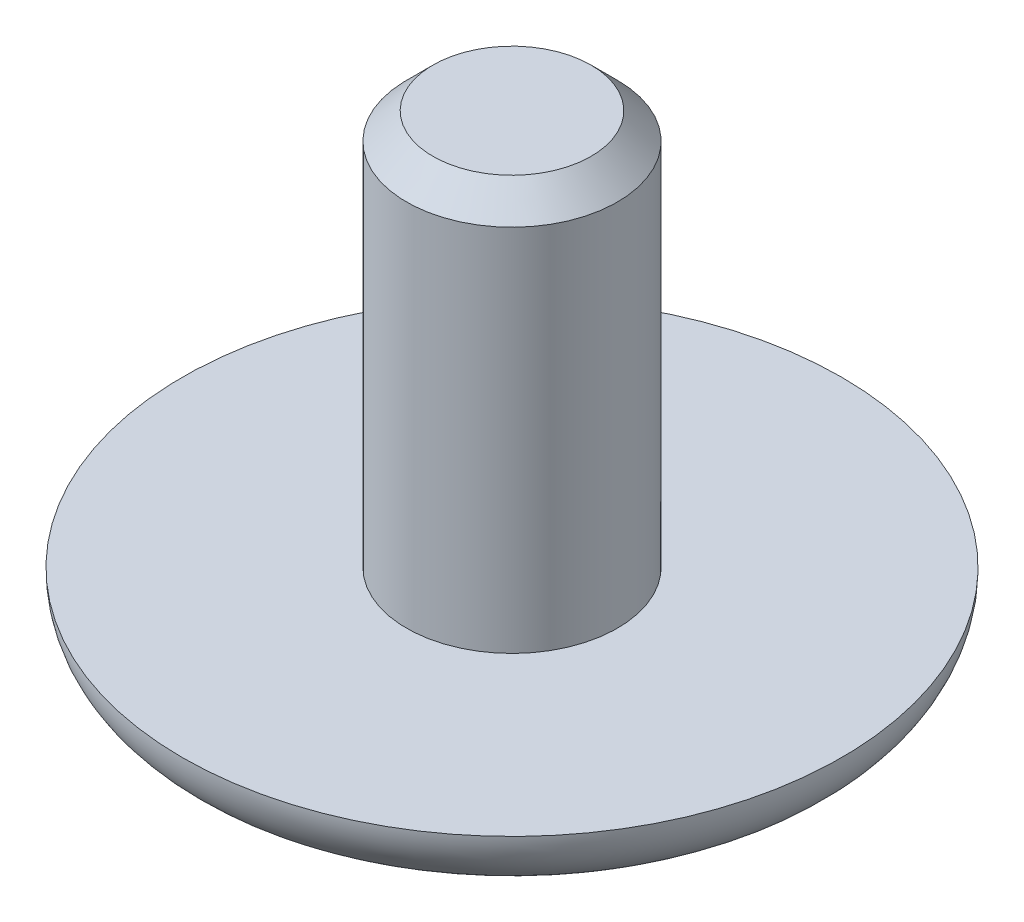
ISO-10303-21;
HEADER;
FILE_DESCRIPTION(('STEP AP214'),'2;1');
FILE_NAME('part.step','',(''),(''),'','','');
FILE_SCHEMA(('AUTOMOTIVE_DESIGN { 1 0 10303 214 1 1 1 1 }'));
ENDSEC;
DATA;
#1=APPLICATION_CONTEXT('core data for automotive mechanical design processes');
#2=APPLICATION_PROTOCOL_DEFINITION('international standard','automotive_design',2000,#1);
#3=PRODUCT_CONTEXT('',#1,'mechanical');
#4=PRODUCT('Part','Part','',(#3));
#5=PRODUCT_RELATED_PRODUCT_CATEGORY('part','',(#4));
#6=PRODUCT_DEFINITION_FORMATION('','',#4);
#7=PRODUCT_DEFINITION_CONTEXT('part definition',#1,'design');
#8=PRODUCT_DEFINITION('design','',#6,#7);
#9=PRODUCT_DEFINITION_SHAPE('','',#8);
#10=(LENGTH_UNIT() NAMED_UNIT(*) SI_UNIT(.MILLI.,.METRE.));
#11=(NAMED_UNIT(*) PLANE_ANGLE_UNIT() SI_UNIT($,.RADIAN.));
#12=(NAMED_UNIT(*) SI_UNIT($,.STERADIAN.) SOLID_ANGLE_UNIT());
#13=UNCERTAINTY_MEASURE_WITH_UNIT(LENGTH_MEASURE(1.E-05),#10,'distance_accuracy_value','');
#14=(GEOMETRIC_REPRESENTATION_CONTEXT(3) GLOBAL_UNCERTAINTY_ASSIGNED_CONTEXT((#13)) GLOBAL_UNIT_ASSIGNED_CONTEXT((#10,
#11,#12)) REPRESENTATION_CONTEXT('',''));
#15=CARTESIAN_POINT('',(0.,0.,0.));
#16=DIRECTION('',(0.,0.,1.));
#17=DIRECTION('',(1.,0.,0.));
#18=AXIS2_PLACEMENT_3D('',#15,#16,#17);
#19=CARTESIAN_POINT('',(0.,0.,0.));
#20=DIRECTION('',(0.,1.,0.));
#21=DIRECTION('',(0.,0.,1.));
#22=AXIS2_PLACEMENT_3D('',#19,#20,#21);
#23=PLANE('',#22);
#24=CARTESIAN_POINT('',(0.,0.,0.));
#25=DIRECTION('',(0.,1.,0.));
#26=DIRECTION('',(0.,0.,1.));
#27=AXIS2_PLACEMENT_3D('',#24,#25,#26);
#28=CIRCLE('',#27,2.);
#29=CARTESIAN_POINT('',(0.,0.,2.));
#30=VERTEX_POINT('',#29);
#31=EDGE_CURVE('E11',#30,#30,#28,.F.);
#32=ORIENTED_EDGE('',*,*,#31,.T.);
#33=EDGE_LOOP('',(#32));
#34=FACE_BOUND('',#33,.T.);
#35=DIRECTION('',(0.,0.,-1.));
#36=VECTOR('',#35,1.);
#37=CARTESIAN_POINT('',(1.75,0.,0.));
#38=LINE('',#37,#36);
#39=CARTESIAN_POINT('',(1.75,0.,0.4));
#40=VERTEX_POINT('',#39);
#41=CARTESIAN_POINT('',(1.75,0.,-0.4));
#42=VERTEX_POINT('',#41);
#43=EDGE_CURVE('E64',#40,#42,#38,.T.);
#44=ORIENTED_EDGE('',*,*,#43,.T.);
#45=DIRECTION('',(1.,0.,0.));
#46=VECTOR('',#45,1.);
#47=CARTESIAN_POINT('',(0.,0.,-0.4));
#48=LINE('',#47,#46);
#49=CARTESIAN_POINT('',(0.4,0.,-0.4));
#50=VERTEX_POINT('',#49);
#51=EDGE_CURVE('E192',#50,#42,#48,.T.);
#52=ORIENTED_EDGE('',*,*,#51,.F.);
#53=DIRECTION('',(0.,0.,-1.));
#54=VECTOR('',#53,1.);
#55=CARTESIAN_POINT('',(0.4,0.,0.));
#56=LINE('',#55,#54);
#57=CARTESIAN_POINT('',(0.4,0.,-1.75));
#58=VERTEX_POINT('',#57);
#59=EDGE_CURVE('E189',#50,#58,#56,.T.);
#60=ORIENTED_EDGE('',*,*,#59,.T.);
#61=DIRECTION('',(1.,0.,0.));
#62=VECTOR('',#61,1.);
#63=CARTESIAN_POINT('',(0.,0.,-1.75));
#64=LINE('',#63,#62);
#65=CARTESIAN_POINT('',(-0.4,0.,-1.75));
#66=VERTEX_POINT('',#65);
#67=EDGE_CURVE('E186',#66,#58,#64,.T.);
#68=ORIENTED_EDGE('',*,*,#67,.F.);
#69=DIRECTION('',(0.,0.,-1.));
#70=VECTOR('',#69,1.);
#71=CARTESIAN_POINT('',(-0.4,0.,0.));
#72=LINE('',#71,#70);
#73=CARTESIAN_POINT('',(-0.4,0.,-0.4));
#74=VERTEX_POINT('',#73);
#75=EDGE_CURVE('E183',#74,#66,#72,.T.);
#76=ORIENTED_EDGE('',*,*,#75,.F.);
#77=DIRECTION('',(1.,0.,0.));
#78=VECTOR('',#77,1.);
#79=CARTESIAN_POINT('',(0.,0.,-0.4));
#80=LINE('',#79,#78);
#81=CARTESIAN_POINT('',(-1.75,0.,-0.4));
#82=VERTEX_POINT('',#81);
#83=EDGE_CURVE('E180',#82,#74,#80,.T.);
#84=ORIENTED_EDGE('',*,*,#83,.F.);
#85=DIRECTION('',(0.,0.,-1.));
#86=VECTOR('',#85,1.);
#87=CARTESIAN_POINT('',(-1.75,0.,0.));
#88=LINE('',#87,#86);
#89=CARTESIAN_POINT('',(-1.75,0.,0.4));
#90=VERTEX_POINT('',#89);
#91=EDGE_CURVE('E177',#90,#82,#88,.T.);
#92=ORIENTED_EDGE('',*,*,#91,.F.);
#93=DIRECTION('',(1.,0.,0.));
#94=VECTOR('',#93,1.);
#95=CARTESIAN_POINT('',(0.,0.,0.4));
#96=LINE('',#95,#94);
#97=CARTESIAN_POINT('',(-0.4,0.,0.4));
#98=VERTEX_POINT('',#97);
#99=EDGE_CURVE('E174',#90,#98,#96,.T.);
#100=ORIENTED_EDGE('',*,*,#99,.T.);
#101=DIRECTION('',(0.,0.,-1.));
#102=VECTOR('',#101,1.);
#103=CARTESIAN_POINT('',(-0.4,0.,0.));
#104=LINE('',#103,#102);
#105=CARTESIAN_POINT('',(-0.4,0.,1.75));
#106=VERTEX_POINT('',#105);
#107=EDGE_CURVE('E168',#106,#98,#104,.T.);
#108=ORIENTED_EDGE('',*,*,#107,.F.);
#109=DIRECTION('',(1.,0.,0.));
#110=VECTOR('',#109,1.);
#111=CARTESIAN_POINT('',(0.,0.,1.75));
#112=LINE('',#111,#110);
#113=CARTESIAN_POINT('',(0.4,0.,1.75));
#114=VERTEX_POINT('',#113);
#115=EDGE_CURVE('E166',#106,#114,#112,.T.);
#116=ORIENTED_EDGE('',*,*,#115,.T.);
#117=DIRECTION('',(0.,0.,-1.));
#118=VECTOR('',#117,1.);
#119=CARTESIAN_POINT('',(0.4,0.,0.));
#120=LINE('',#119,#118);
#121=CARTESIAN_POINT('',(0.4,0.,0.4));
#122=VERTEX_POINT('',#121);
#123=EDGE_CURVE('E152',#114,#122,#120,.T.);
#124=ORIENTED_EDGE('',*,*,#123,.T.);
#125=DIRECTION('',(1.,0.,0.));
#126=VECTOR('',#125,1.);
#127=CARTESIAN_POINT('',(0.,0.,0.4));
#128=LINE('',#127,#126);
#129=EDGE_CURVE('E160',#122,#40,#128,.T.);
#130=ORIENTED_EDGE('',*,*,#129,.T.);
#131=EDGE_LOOP('',(#44,#52,#60,#68,#76,#84,#92,#100,#108,#116,#124,#130));
#132=FACE_BOUND('',#131,.T.);
#133=ADVANCED_FACE('F49',(#34,#132),#23,.F.);
#134=CARTESIAN_POINT('',(-2.5,0.5,0.));
#135=DIRECTION('',(0.,-1.,0.));
#136=DIRECTION('',(0.,0.,-1.));
#137=AXIS2_PLACEMENT_3D('',#134,#135,#136);
#138=PLANE('',#137);
#139=CARTESIAN_POINT('',(0.,0.5,0.));
#140=DIRECTION('',(0.,-1.,0.));
#141=DIRECTION('',(0.,0.,-1.));
#142=AXIS2_PLACEMENT_3D('',#139,#140,#141);
#143=CIRCLE('',#142,2.5);
#144=CARTESIAN_POINT('',(0.,0.5,-2.5));
#145=VERTEX_POINT('',#144);
#146=EDGE_CURVE('E242',#145,#145,#143,.T.);
#147=ORIENTED_EDGE('',*,*,#146,.F.);
#148=EDGE_LOOP('',(#147));
#149=FACE_BOUND('',#148,.T.);
#150=CARTESIAN_POINT('',(0.,0.5,0.));
#151=DIRECTION('',(0.,-1.,0.));
#152=DIRECTION('',(0.,0.,-1.));
#153=AXIS2_PLACEMENT_3D('',#150,#151,#152);
#154=CIRCLE('',#153,0.8);
#155=CARTESIAN_POINT('',(0.,0.5,-0.8));
#156=VERTEX_POINT('',#155);
#157=EDGE_CURVE('E195',#156,#156,#154,.T.);
#158=ORIENTED_EDGE('',*,*,#157,.T.);
#159=EDGE_LOOP('',(#158));
#160=FACE_BOUND('',#159,.T.);
#161=ADVANCED_FACE('F260',(#149,#160),#138,.F.);
#162=CARTESIAN_POINT('',(0.,0.,0.));
#163=DIRECTION('',(0.,-1.,0.));
#164=DIRECTION('',(0.,0.,-1.));
#165=AXIS2_PLACEMENT_3D('',#162,#163,#164);
#166=CYLINDRICAL_SURFACE('',#165,0.8);
#167=CARTESIAN_POINT('',(0.,3.3,0.));
#168=DIRECTION('',(0.,-1.,0.));
#169=DIRECTION('',(0.,0.,-1.));
#170=AXIS2_PLACEMENT_3D('',#167,#168,#169);
#171=CIRCLE('',#170,0.8);
#172=CARTESIAN_POINT('',(0.,3.3,-0.8));
#173=VERTEX_POINT('',#172);
#174=EDGE_CURVE('E245',#173,#173,#171,.T.);
#175=ORIENTED_EDGE('',*,*,#174,.T.);
#176=EDGE_LOOP('',(#175));
#177=FACE_BOUND('',#176,.T.);
#178=ORIENTED_EDGE('',*,*,#157,.F.);
#179=EDGE_LOOP('',(#178));
#180=FACE_BOUND('',#179,.T.);
#181=ADVANCED_FACE('F257',(#177,#180),#166,.T.);
#182=CARTESIAN_POINT('',(-0.8,3.5,0.));
#183=DIRECTION('',(0.,-1.,0.));
#184=DIRECTION('',(0.,0.,-1.));
#185=AXIS2_PLACEMENT_3D('',#182,#183,#184);
#186=PLANE('',#185);
#187=CARTESIAN_POINT('',(0.,3.5,0.));
#188=DIRECTION('',(0.,-1.,0.));
#189=DIRECTION('',(0.,0.,-1.));
#190=AXIS2_PLACEMENT_3D('',#187,#188,#189);
#191=CIRCLE('',#190,0.599999999999999);
#192=CARTESIAN_POINT('',(0.,3.5,-0.599999999999999));
#193=VERTEX_POINT('',#192);
#194=EDGE_CURVE('E57',#193,#193,#191,.F.);
#195=ORIENTED_EDGE('',*,*,#194,.T.);
#196=EDGE_LOOP('',(#195));
#197=FACE_BOUND('',#196,.T.);
#198=ADVANCED_FACE('F250',(#197),#186,.F.);
#199=CARTESIAN_POINT('',(0.,3.3,0.));
#200=DIRECTION('',(0.,-1.,0.));
#201=DIRECTION('',(0.,0.,-1.));
#202=AXIS2_PLACEMENT_3D('',#199,#200,#201);
#203=CONICAL_SURFACE('',#202,0.8,0.785398163397453);
#204=ORIENTED_EDGE('',*,*,#194,.F.);
#205=EDGE_LOOP('',(#204));
#206=FACE_BOUND('',#205,.T.);
#207=ORIENTED_EDGE('',*,*,#174,.F.);
#208=EDGE_LOOP('',(#207));
#209=FACE_BOUND('',#208,.T.);
#210=ADVANCED_FACE('F252',(#206,#209),#203,.T.);
#211=CARTESIAN_POINT('',(0.,0.5,0.));
#212=DIRECTION('',(0.,1.,0.));
#213=DIRECTION('',(0.,0.,1.));
#214=AXIS2_PLACEMENT_3D('',#211,#212,#213);
#215=TOROIDAL_SURFACE('',#214,2.,0.5);
#216=ORIENTED_EDGE('',*,*,#146,.T.);
#217=EDGE_LOOP('',(#216));
#218=FACE_BOUND('',#217,.T.);
#219=ORIENTED_EDGE('',*,*,#31,.F.);
#220=EDGE_LOOP('',(#219));
#221=FACE_BOUND('',#220,.T.);
#222=ADVANCED_FACE('F51',(#218,#221),#215,.T.);
#223=CARTESIAN_POINT('',(1.75,0.,0.));
#224=DIRECTION('',(0.90630778703665,0.4226182617407,0.));
#225=DIRECTION('',(-0.4226182617407,0.90630778703665,0.));
#226=AXIS2_PLACEMENT_3D('',#223,#224,#225);
#227=PLANE('',#226);
#228=ORIENTED_EDGE('',*,*,#43,.F.);
#229=DIRECTION('',(0.389281620635025,-0.834817129478988,0.389281620635025));
#230=VECTOR('',#229,1.);
#231=CARTESIAN_POINT('',(1.68938392793431,0.129991586038984,0.339383927934307));
#232=LINE('',#231,#230);
#233=CARTESIAN_POINT('',(1.6101077025535,0.3,0.2601077025535));
#234=VERTEX_POINT('',#233);
#235=EDGE_CURVE('E157',#234,#40,#232,.T.);
#236=ORIENTED_EDGE('',*,*,#235,.F.);
#237=DIRECTION('',(0.,0.,1.));
#238=VECTOR('',#237,1.);
#239=CARTESIAN_POINT('',(1.6101077025535,0.3,0.));
#240=LINE('',#239,#238);
#241=CARTESIAN_POINT('',(1.6101077025535,0.3,-0.2601077025535));
#242=VERTEX_POINT('',#241);
#243=EDGE_CURVE('E70',#234,#242,#240,.F.);
#244=ORIENTED_EDGE('',*,*,#243,.T.);
#245=DIRECTION('',(-0.389281620635025,0.834817129478988,0.389281620635025));
#246=VECTOR('',#245,1.);
#247=CARTESIAN_POINT('',(1.68938392793431,0.129991586038984,-0.339383927934307));
#248=LINE('',#247,#246);
#249=EDGE_CURVE('E111',#242,#42,#248,.F.);
#250=ORIENTED_EDGE('',*,*,#249,.T.);
#251=EDGE_LOOP('',(#228,#236,#244,#250));
#252=FACE_BOUND('',#251,.T.);
#253=ADVANCED_FACE('F283',(#252),#227,.F.);
#254=CARTESIAN_POINT('',(0.,0.,-0.4));
#255=DIRECTION('',(0.,0.4226182617407,-0.90630778703665));
#256=DIRECTION('',(0.,0.90630778703665,0.4226182617407));
#257=AXIS2_PLACEMENT_3D('',#254,#255,#256);
#258=PLANE('',#257);
#259=ORIENTED_EDGE('',*,*,#51,.T.);
#260=ORIENTED_EDGE('',*,*,#249,.F.);
#261=DIRECTION('',(1.,0.,0.));
#262=VECTOR('',#261,1.);
#263=CARTESIAN_POINT('',(0.,0.3,-0.2601077025535));
#264=LINE('',#263,#262);
#265=CARTESIAN_POINT('',(0.2601077025535,0.3,-0.2601077025535));
#266=VERTEX_POINT('',#265);
#267=EDGE_CURVE('E196',#266,#242,#264,.T.);
#268=ORIENTED_EDGE('',*,*,#267,.F.);
#269=DIRECTION('',(-0.389281620635025,0.834817129478988,0.389281620635025));
#270=VECTOR('',#269,1.);
#271=CARTESIAN_POINT('',(0.339383927934307,0.129991586038984,-0.339383927934307));
#272=LINE('',#271,#270);
#273=EDGE_CURVE('E117',#266,#50,#272,.F.);
#274=ORIENTED_EDGE('',*,*,#273,.T.);
#275=EDGE_LOOP('',(#259,#260,#268,#274));
#276=FACE_BOUND('',#275,.T.);
#277=ADVANCED_FACE('F279',(#276),#258,.F.);
#278=CARTESIAN_POINT('',(0.4,0.,0.));
#279=DIRECTION('',(0.90630778703665,0.4226182617407,0.));
#280=DIRECTION('',(-0.4226182617407,0.90630778703665,0.));
#281=AXIS2_PLACEMENT_3D('',#278,#279,#280);
#282=PLANE('',#281);
#283=ORIENTED_EDGE('',*,*,#59,.F.);
#284=ORIENTED_EDGE('',*,*,#273,.F.);
#285=DIRECTION('',(0.,0.,1.));
#286=VECTOR('',#285,1.);
#287=CARTESIAN_POINT('',(0.2601077025535,0.3,0.));
#288=LINE('',#287,#286);
#289=CARTESIAN_POINT('',(0.2601077025535,0.3,-1.6101077025535));
#290=VERTEX_POINT('',#289);
#291=EDGE_CURVE('E217',#266,#290,#288,.F.);
#292=ORIENTED_EDGE('',*,*,#291,.T.);
#293=DIRECTION('',(-0.389281620635025,0.834817129478988,0.389281620635025));
#294=VECTOR('',#293,1.);
#295=CARTESIAN_POINT('',(0.134804684712595,0.568713188920555,-1.48480468471259));
#296=LINE('',#295,#294);
#297=EDGE_CURVE('E211',#290,#58,#296,.F.);
#298=ORIENTED_EDGE('',*,*,#297,.T.);
#299=EDGE_LOOP('',(#283,#284,#292,#298));
#300=FACE_BOUND('',#299,.T.);
#301=ADVANCED_FACE('F282',(#300),#282,.F.);
#302=CARTESIAN_POINT('',(0.,0.,-1.75));
#303=DIRECTION('',(0.,0.4226182617407,-0.90630778703665));
#304=DIRECTION('',(0.,0.90630778703665,0.4226182617407));
#305=AXIS2_PLACEMENT_3D('',#302,#303,#304);
#306=PLANE('',#305);
#307=ORIENTED_EDGE('',*,*,#67,.T.);
#308=ORIENTED_EDGE('',*,*,#297,.F.);
#309=DIRECTION('',(1.,0.,0.));
#310=VECTOR('',#309,1.);
#311=CARTESIAN_POINT('',(0.,0.3,-1.6101077025535));
#312=LINE('',#311,#310);
#313=CARTESIAN_POINT('',(-0.2601077025535,0.3,-1.6101077025535));
#314=VERTEX_POINT('',#313);
#315=EDGE_CURVE('E219',#314,#290,#312,.T.);
#316=ORIENTED_EDGE('',*,*,#315,.F.);
#317=DIRECTION('',(-0.389281620635025,-0.834817129478988,-0.389281620635025));
#318=VECTOR('',#317,1.);
#319=CARTESIAN_POINT('',(-0.134804684712595,0.568713188920555,-1.48480468471259));
#320=LINE('',#319,#318);
#321=EDGE_CURVE('E209',#314,#66,#320,.T.);
#322=ORIENTED_EDGE('',*,*,#321,.T.);
#323=EDGE_LOOP('',(#307,#308,#316,#322));
#324=FACE_BOUND('',#323,.T.);
#325=ADVANCED_FACE('F286',(#324),#306,.F.);
#326=CARTESIAN_POINT('',(-0.4,0.,0.));
#327=DIRECTION('',(-0.90630778703665,0.4226182617407,0.));
#328=DIRECTION('',(-0.4226182617407,-0.90630778703665,0.));
#329=AXIS2_PLACEMENT_3D('',#326,#327,#328);
#330=PLANE('',#329);
#331=ORIENTED_EDGE('',*,*,#75,.T.);
#332=ORIENTED_EDGE('',*,*,#321,.F.);
#333=DIRECTION('',(0.,0.,-1.));
#334=VECTOR('',#333,1.);
#335=CARTESIAN_POINT('',(-0.2601077025535,0.3,0.));
#336=LINE('',#335,#334);
#337=CARTESIAN_POINT('',(-0.2601077025535,0.3,-0.2601077025535));
#338=VERTEX_POINT('',#337);
#339=EDGE_CURVE('E222',#338,#314,#336,.T.);
#340=ORIENTED_EDGE('',*,*,#339,.F.);
#341=DIRECTION('',(-0.389281620635025,-0.834817129478988,-0.389281620635025));
#342=VECTOR('',#341,1.);
#343=CARTESIAN_POINT('',(-0.339383927934307,0.129991586038984,-0.339383927934307));
#344=LINE('',#343,#342);
#345=EDGE_CURVE('E207',#338,#74,#344,.T.);
#346=ORIENTED_EDGE('',*,*,#345,.T.);
#347=EDGE_LOOP('',(#331,#332,#340,#346));
#348=FACE_BOUND('',#347,.T.);
#349=ADVANCED_FACE('F290',(#348),#330,.F.);
#350=CARTESIAN_POINT('',(0.,0.,-0.4));
#351=DIRECTION('',(0.,0.4226182617407,-0.90630778703665));
#352=DIRECTION('',(0.,0.90630778703665,0.4226182617407));
#353=AXIS2_PLACEMENT_3D('',#350,#351,#352);
#354=PLANE('',#353);
#355=ORIENTED_EDGE('',*,*,#83,.T.);
#356=ORIENTED_EDGE('',*,*,#345,.F.);
#357=DIRECTION('',(1.,0.,0.));
#358=VECTOR('',#357,1.);
#359=CARTESIAN_POINT('',(0.,0.3,-0.2601077025535));
#360=LINE('',#359,#358);
#361=CARTESIAN_POINT('',(-1.6101077025535,0.3,-0.2601077025535));
#362=VERTEX_POINT('',#361);
#363=EDGE_CURVE('E225',#362,#338,#360,.T.);
#364=ORIENTED_EDGE('',*,*,#363,.F.);
#365=DIRECTION('',(-0.389281620635025,-0.834817129478988,-0.389281620635025));
#366=VECTOR('',#365,1.);
#367=CARTESIAN_POINT('',(-1.68938392793431,0.129991586038984,-0.339383927934307));
#368=LINE('',#367,#366);
#369=EDGE_CURVE('E205',#362,#82,#368,.T.);
#370=ORIENTED_EDGE('',*,*,#369,.T.);
#371=EDGE_LOOP('',(#355,#356,#364,#370));
#372=FACE_BOUND('',#371,.T.);
#373=ADVANCED_FACE('F294',(#372),#354,.F.);
#374=CARTESIAN_POINT('',(-1.75,0.,0.));
#375=DIRECTION('',(-0.90630778703665,0.4226182617407,0.));
#376=DIRECTION('',(-0.4226182617407,-0.90630778703665,0.));
#377=AXIS2_PLACEMENT_3D('',#374,#375,#376);
#378=PLANE('',#377);
#379=ORIENTED_EDGE('',*,*,#91,.T.);
#380=ORIENTED_EDGE('',*,*,#369,.F.);
#381=DIRECTION('',(0.,0.,-1.));
#382=VECTOR('',#381,1.);
#383=CARTESIAN_POINT('',(-1.6101077025535,0.3,0.));
#384=LINE('',#383,#382);
#385=CARTESIAN_POINT('',(-1.6101077025535,0.3,0.2601077025535));
#386=VERTEX_POINT('',#385);
#387=EDGE_CURVE('E228',#386,#362,#384,.T.);
#388=ORIENTED_EDGE('',*,*,#387,.F.);
#389=DIRECTION('',(0.389281620635025,0.834817129478988,-0.389281620635025));
#390=VECTOR('',#389,1.);
#391=CARTESIAN_POINT('',(-1.68938392793431,0.129991586038984,0.339383927934307));
#392=LINE('',#391,#390);
#393=EDGE_CURVE('E203',#386,#90,#392,.F.);
#394=ORIENTED_EDGE('',*,*,#393,.T.);
#395=EDGE_LOOP('',(#379,#380,#388,#394));
#396=FACE_BOUND('',#395,.T.);
#397=ADVANCED_FACE('F298',(#396),#378,.F.);
#398=CARTESIAN_POINT('',(0.,0.,0.4));
#399=DIRECTION('',(0.,0.4226182617407,0.90630778703665));
#400=DIRECTION('',(0.,-0.90630778703665,0.4226182617407));
#401=AXIS2_PLACEMENT_3D('',#398,#399,#400);
#402=PLANE('',#401);
#403=ORIENTED_EDGE('',*,*,#99,.F.);
#404=ORIENTED_EDGE('',*,*,#393,.F.);
#405=DIRECTION('',(-1.,0.,0.));
#406=VECTOR('',#405,1.);
#407=CARTESIAN_POINT('',(0.,0.3,0.2601077025535));
#408=LINE('',#407,#406);
#409=CARTESIAN_POINT('',(-0.2601077025535,0.3,0.2601077025535));
#410=VERTEX_POINT('',#409);
#411=EDGE_CURVE('E231',#386,#410,#408,.F.);
#412=ORIENTED_EDGE('',*,*,#411,.T.);
#413=DIRECTION('',(0.389281620635025,0.834817129478988,-0.389281620635025));
#414=VECTOR('',#413,1.);
#415=CARTESIAN_POINT('',(-0.339383927934307,0.129991586038984,0.339383927934307));
#416=LINE('',#415,#414);
#417=EDGE_CURVE('E201',#410,#98,#416,.F.);
#418=ORIENTED_EDGE('',*,*,#417,.T.);
#419=EDGE_LOOP('',(#403,#404,#412,#418));
#420=FACE_BOUND('',#419,.T.);
#421=ADVANCED_FACE('F302',(#420),#402,.F.);
#422=CARTESIAN_POINT('',(-0.4,0.,0.));
#423=DIRECTION('',(-0.90630778703665,0.4226182617407,0.));
#424=DIRECTION('',(-0.4226182617407,-0.90630778703665,0.));
#425=AXIS2_PLACEMENT_3D('',#422,#423,#424);
#426=PLANE('',#425);
#427=ORIENTED_EDGE('',*,*,#107,.T.);
#428=ORIENTED_EDGE('',*,*,#417,.F.);
#429=DIRECTION('',(0.,0.,-1.));
#430=VECTOR('',#429,1.);
#431=CARTESIAN_POINT('',(-0.2601077025535,0.3,0.));
#432=LINE('',#431,#430);
#433=CARTESIAN_POINT('',(-0.260107702553501,0.3,1.6101077025535));
#434=VERTEX_POINT('',#433);
#435=EDGE_CURVE('E233',#434,#410,#432,.T.);
#436=ORIENTED_EDGE('',*,*,#435,.F.);
#437=DIRECTION('',(0.389281620635025,0.834817129478988,-0.389281620635025));
#438=VECTOR('',#437,1.);
#439=CARTESIAN_POINT('',(-0.134804684712595,0.568713188920555,1.48480468471259));
#440=LINE('',#439,#438);
#441=EDGE_CURVE('E199',#434,#106,#440,.F.);
#442=ORIENTED_EDGE('',*,*,#441,.T.);
#443=EDGE_LOOP('',(#427,#428,#436,#442));
#444=FACE_BOUND('',#443,.T.);
#445=ADVANCED_FACE('F306',(#444),#426,.F.);
#446=CARTESIAN_POINT('',(0.,0.,1.75));
#447=DIRECTION('',(0.,0.4226182617407,0.90630778703665));
#448=DIRECTION('',(0.,-0.90630778703665,0.4226182617407));
#449=AXIS2_PLACEMENT_3D('',#446,#447,#448);
#450=PLANE('',#449);
#451=ORIENTED_EDGE('',*,*,#115,.F.);
#452=ORIENTED_EDGE('',*,*,#441,.F.);
#453=DIRECTION('',(-1.,0.,0.));
#454=VECTOR('',#453,1.);
#455=CARTESIAN_POINT('',(0.,0.3,1.6101077025535));
#456=LINE('',#455,#454);
#457=CARTESIAN_POINT('',(0.2601077025535,0.3,1.6101077025535));
#458=VERTEX_POINT('',#457);
#459=EDGE_CURVE('E236',#434,#458,#456,.F.);
#460=ORIENTED_EDGE('',*,*,#459,.T.);
#461=DIRECTION('',(0.389281620635025,-0.834817129478988,0.389281620635025));
#462=VECTOR('',#461,1.);
#463=CARTESIAN_POINT('',(0.134804684712594,0.568713188920555,1.48480468471259));
#464=LINE('',#463,#462);
#465=EDGE_CURVE('E156',#458,#114,#464,.T.);
#466=ORIENTED_EDGE('',*,*,#465,.T.);
#467=EDGE_LOOP('',(#451,#452,#460,#466));
#468=FACE_BOUND('',#467,.T.);
#469=ADVANCED_FACE('F310',(#468),#450,.F.);
#470=CARTESIAN_POINT('',(0.4,0.,0.));
#471=DIRECTION('',(0.90630778703665,0.4226182617407,0.));
#472=DIRECTION('',(-0.4226182617407,0.90630778703665,0.));
#473=AXIS2_PLACEMENT_3D('',#470,#471,#472);
#474=PLANE('',#473);
#475=ORIENTED_EDGE('',*,*,#123,.F.);
#476=ORIENTED_EDGE('',*,*,#465,.F.);
#477=DIRECTION('',(0.,0.,1.));
#478=VECTOR('',#477,1.);
#479=CARTESIAN_POINT('',(0.2601077025535,0.3,0.));
#480=LINE('',#479,#478);
#481=CARTESIAN_POINT('',(0.2601077025535,0.3,0.2601077025535));
#482=VERTEX_POINT('',#481);
#483=EDGE_CURVE('E155',#458,#482,#480,.F.);
#484=ORIENTED_EDGE('',*,*,#483,.T.);
#485=DIRECTION('',(0.389281620635025,-0.834817129478988,0.389281620635025));
#486=VECTOR('',#485,1.);
#487=CARTESIAN_POINT('',(0.339383927934307,0.129991586038984,0.339383927934307));
#488=LINE('',#487,#486);
#489=EDGE_CURVE('E147',#482,#122,#488,.T.);
#490=ORIENTED_EDGE('',*,*,#489,.T.);
#491=EDGE_LOOP('',(#475,#476,#484,#490));
#492=FACE_BOUND('',#491,.T.);
#493=ADVANCED_FACE('F149',(#492),#474,.F.);
#494=CARTESIAN_POINT('',(0.,0.,0.4));
#495=DIRECTION('',(0.,0.4226182617407,0.90630778703665));
#496=DIRECTION('',(0.,-0.90630778703665,0.4226182617407));
#497=AXIS2_PLACEMENT_3D('',#494,#495,#496);
#498=PLANE('',#497);
#499=ORIENTED_EDGE('',*,*,#129,.F.);
#500=ORIENTED_EDGE('',*,*,#489,.F.);
#501=DIRECTION('',(-1.,0.,0.));
#502=VECTOR('',#501,1.);
#503=CARTESIAN_POINT('',(0.,0.3,0.2601077025535));
#504=LINE('',#503,#502);
#505=EDGE_CURVE('E109',#482,#234,#504,.F.);
#506=ORIENTED_EDGE('',*,*,#505,.T.);
#507=ORIENTED_EDGE('',*,*,#235,.T.);
#508=EDGE_LOOP('',(#499,#500,#506,#507));
#509=FACE_BOUND('',#508,.T.);
#510=ADVANCED_FACE('F161',(#509),#498,.F.);
#511=CARTESIAN_POINT('',(0.,0.3,0.));
#512=DIRECTION('',(0.,-1.,0.));
#513=DIRECTION('',(0.,0.,-1.));
#514=AXIS2_PLACEMENT_3D('',#511,#512,#513);
#515=PLANE('',#514);
#516=ORIENTED_EDGE('',*,*,#243,.F.);
#517=ORIENTED_EDGE('',*,*,#505,.F.);
#518=ORIENTED_EDGE('',*,*,#483,.F.);
#519=ORIENTED_EDGE('',*,*,#459,.F.);
#520=ORIENTED_EDGE('',*,*,#435,.T.);
#521=ORIENTED_EDGE('',*,*,#411,.F.);
#522=ORIENTED_EDGE('',*,*,#387,.T.);
#523=ORIENTED_EDGE('',*,*,#363,.T.);
#524=ORIENTED_EDGE('',*,*,#339,.T.);
#525=ORIENTED_EDGE('',*,*,#315,.T.);
#526=ORIENTED_EDGE('',*,*,#291,.F.);
#527=ORIENTED_EDGE('',*,*,#267,.T.);
#528=EDGE_LOOP('',(#516,#517,#518,#519,#520,#521,#522,#523,#524,#525,#526,#527));
#529=FACE_BOUND('',#528,.T.);
#530=ADVANCED_FACE('F319',(#529),#515,.T.);
#531=CLOSED_SHELL('',(#133,#161,#181,#198,#210,#222,#253,#277,#301,#325,#349,#373,#397,#421,
#445,#469,#493,#510,#530));
#532=MANIFOLD_SOLID_BREP('B2',#531);
#533=ADVANCED_BREP_SHAPE_REPRESENTATION('',(#18,#532),#14);
#534=SHAPE_DEFINITION_REPRESENTATION(#9,#533);
ENDSEC;
END-ISO-10303-21;
